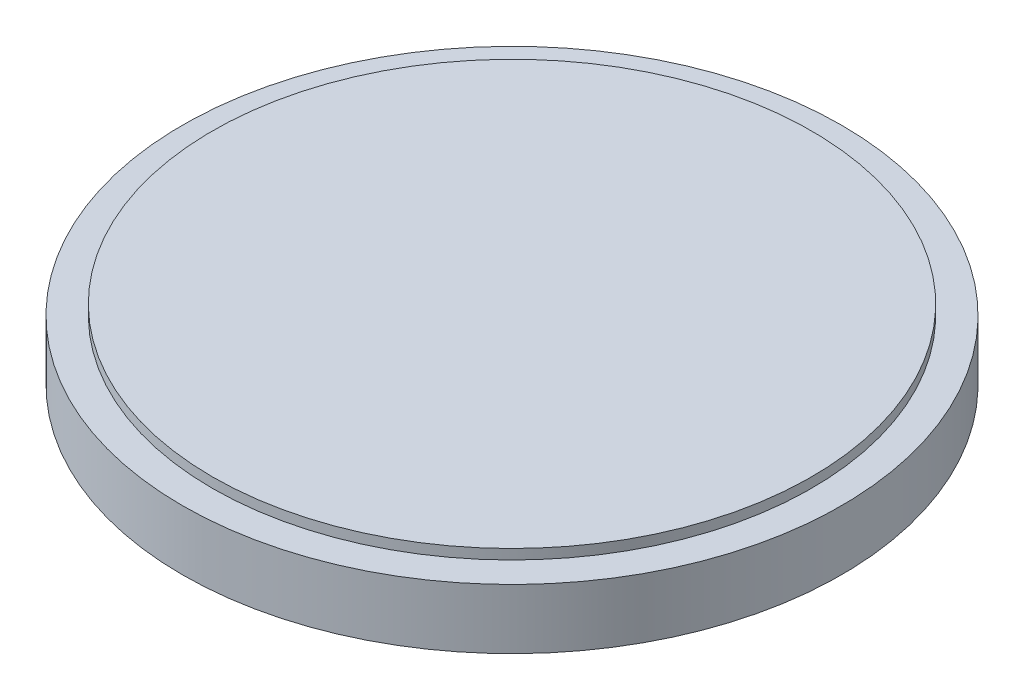
ISO-10303-21;
HEADER;
FILE_DESCRIPTION(('STEP AP214'),'2;1');
FILE_NAME('part.step','',(''),(''),'','','');
FILE_SCHEMA(('AUTOMOTIVE_DESIGN { 1 0 10303 214 1 1 1 1 }'));
ENDSEC;
DATA;
#1=APPLICATION_CONTEXT('core data for automotive mechanical design processes');
#2=APPLICATION_PROTOCOL_DEFINITION('international standard','automotive_design',2000,#1);
#3=PRODUCT_CONTEXT('',#1,'mechanical');
#4=PRODUCT('Part','Part','',(#3));
#5=PRODUCT_RELATED_PRODUCT_CATEGORY('part','',(#4));
#6=PRODUCT_DEFINITION_FORMATION('','',#4);
#7=PRODUCT_DEFINITION_CONTEXT('part definition',#1,'design');
#8=PRODUCT_DEFINITION('design','',#6,#7);
#9=PRODUCT_DEFINITION_SHAPE('','',#8);
#10=(LENGTH_UNIT() NAMED_UNIT(*) SI_UNIT(.MILLI.,.METRE.));
#11=(NAMED_UNIT(*) PLANE_ANGLE_UNIT() SI_UNIT($,.RADIAN.));
#12=(NAMED_UNIT(*) SI_UNIT($,.STERADIAN.) SOLID_ANGLE_UNIT());
#13=UNCERTAINTY_MEASURE_WITH_UNIT(LENGTH_MEASURE(1.E-05),#10,'distance_accuracy_value','');
#14=(GEOMETRIC_REPRESENTATION_CONTEXT(3) GLOBAL_UNCERTAINTY_ASSIGNED_CONTEXT((#13)) GLOBAL_UNIT_ASSIGNED_CONTEXT((#10,
#11,#12)) REPRESENTATION_CONTEXT('',''));
#15=CARTESIAN_POINT('',(0.,0.,0.));
#16=DIRECTION('',(0.,0.,1.));
#17=DIRECTION('',(1.,0.,0.));
#18=AXIS2_PLACEMENT_3D('',#15,#16,#17);
#19=CARTESIAN_POINT('',(0.,7.,0.));
#20=DIRECTION('',(0.,-1.,0.));
#21=DIRECTION('',(0.,0.,-1.));
#22=AXIS2_PLACEMENT_3D('',#19,#20,#21);
#23=CYLINDRICAL_SURFACE('',#22,30.);
#24=CARTESIAN_POINT('',(0.,7.,0.));
#25=DIRECTION('',(0.,1.,0.));
#26=DIRECTION('',(0.,0.,1.));
#27=AXIS2_PLACEMENT_3D('',#24,#25,#26);
#28=CIRCLE('',#27,30.);
#29=CARTESIAN_POINT('',(0.,7.,30.));
#30=VERTEX_POINT('',#29);
#31=EDGE_CURVE('E11',#30,#30,#28,.T.);
#32=ORIENTED_EDGE('',*,*,#31,.F.);
#33=EDGE_LOOP('',(#32));
#34=FACE_BOUND('',#33,.T.);
#35=CARTESIAN_POINT('',(0.,6.,0.));
#36=DIRECTION('',(0.,1.,0.));
#37=DIRECTION('',(0.,0.,1.));
#38=AXIS2_PLACEMENT_3D('',#35,#36,#37);
#39=CIRCLE('',#38,30.);
#40=CARTESIAN_POINT('',(0.,6.,30.));
#41=VERTEX_POINT('',#40);
#42=EDGE_CURVE('E55',#41,#41,#39,.T.);
#43=ORIENTED_EDGE('',*,*,#42,.T.);
#44=EDGE_LOOP('',(#43));
#45=FACE_BOUND('',#44,.T.);
#46=ADVANCED_FACE('F47',(#34,#45),#23,.T.);
#47=CARTESIAN_POINT('',(0.,7.,0.));
#48=DIRECTION('',(0.,1.,0.));
#49=DIRECTION('',(0.,0.,1.));
#50=AXIS2_PLACEMENT_3D('',#47,#48,#49);
#51=PLANE('',#50);
#52=ORIENTED_EDGE('',*,*,#31,.T.);
#53=EDGE_LOOP('',(#52));
#54=FACE_BOUND('',#53,.T.);
#55=ADVANCED_FACE('F65',(#54),#51,.T.);
#56=CARTESIAN_POINT('',(0.,6.,0.));
#57=DIRECTION('',(0.,1.,0.));
#58=DIRECTION('',(0.,0.,1.));
#59=AXIS2_PLACEMENT_3D('',#56,#57,#58);
#60=PLANE('',#59);
#61=ORIENTED_EDGE('',*,*,#42,.F.);
#62=EDGE_LOOP('',(#61));
#63=FACE_BOUND('',#62,.T.);
#64=ADVANCED_FACE('F64',(#63),#60,.F.);
#65=CLOSED_SHELL('',(#46,#55,#64));
#66=MANIFOLD_SOLID_BREP('B2',#65);
#67=CARTESIAN_POINT('',(0.,6.,0.));
#68=DIRECTION('',(0.,1.,0.));
#69=DIRECTION('',(0.,0.,1.));
#70=AXIS2_PLACEMENT_3D('',#67,#68,#69);
#71=PLANE('',#70);
#72=CARTESIAN_POINT('',(0.,6.,0.));
#73=DIRECTION('',(0.,1.,0.));
#74=DIRECTION('',(0.,0.,1.));
#75=AXIS2_PLACEMENT_3D('',#72,#73,#74);
#76=CIRCLE('',#75,33.);
#77=CARTESIAN_POINT('',(0.,6.,33.));
#78=VERTEX_POINT('',#77);
#79=EDGE_CURVE('E48',#78,#78,#76,.T.);
#80=ORIENTED_EDGE('',*,*,#79,.T.);
#81=EDGE_LOOP('',(#80));
#82=FACE_BOUND('',#81,.T.);
#83=CARTESIAN_POINT('',(0.,6.,0.));
#84=DIRECTION('',(0.,1.,0.));
#85=DIRECTION('',(0.,0.,1.));
#86=AXIS2_PLACEMENT_3D('',#83,#84,#85);
#87=CIRCLE('',#86,29.);
#88=CARTESIAN_POINT('',(0.,6.,29.));
#89=VERTEX_POINT('',#88);
#90=EDGE_CURVE('E101',#89,#89,#87,.T.);
#91=ORIENTED_EDGE('',*,*,#90,.F.);
#92=EDGE_LOOP('',(#91));
#93=FACE_BOUND('',#92,.T.);
#94=ADVANCED_FACE('F87',(#82,#93),#71,.T.);
#95=CARTESIAN_POINT('',(0.,0.,0.));
#96=DIRECTION('',(0.,1.,0.));
#97=DIRECTION('',(0.,0.,1.));
#98=AXIS2_PLACEMENT_3D('',#95,#96,#97);
#99=PLANE('',#98);
#100=CARTESIAN_POINT('',(0.,0.,0.));
#101=DIRECTION('',(0.,1.,0.));
#102=DIRECTION('',(0.,0.,1.));
#103=AXIS2_PLACEMENT_3D('',#100,#101,#102);
#104=CIRCLE('',#103,30.);
#105=CARTESIAN_POINT('',(0.,0.,30.));
#106=VERTEX_POINT('',#105);
#107=EDGE_CURVE('E110',#106,#106,#104,.T.);
#108=ORIENTED_EDGE('',*,*,#107,.T.);
#109=EDGE_LOOP('',(#108));
#110=FACE_BOUND('',#109,.T.);
#111=CARTESIAN_POINT('',(0.,0.,0.));
#112=DIRECTION('',(0.,1.,0.));
#113=DIRECTION('',(0.,0.,1.));
#114=AXIS2_PLACEMENT_3D('',#111,#112,#113);
#115=CIRCLE('',#114,33.);
#116=CARTESIAN_POINT('',(0.,0.,33.));
#117=VERTEX_POINT('',#116);
#118=EDGE_CURVE('E96',#117,#117,#115,.T.);
#119=ORIENTED_EDGE('',*,*,#118,.F.);
#120=EDGE_LOOP('',(#119));
#121=FACE_BOUND('',#120,.T.);
#122=ADVANCED_FACE('F127',(#110,#121),#99,.F.);
#123=CARTESIAN_POINT('',(0.,6.,0.));
#124=DIRECTION('',(0.,-1.,0.));
#125=DIRECTION('',(0.,0.,-1.));
#126=AXIS2_PLACEMENT_3D('',#123,#124,#125);
#127=CYLINDRICAL_SURFACE('',#126,33.);
#128=ORIENTED_EDGE('',*,*,#79,.F.);
#129=EDGE_LOOP('',(#128));
#130=FACE_BOUND('',#129,.T.);
#131=ORIENTED_EDGE('',*,*,#118,.T.);
#132=EDGE_LOOP('',(#131));
#133=FACE_BOUND('',#132,.T.);
#134=ADVANCED_FACE('F95',(#130,#133),#127,.T.);
#135=CARTESIAN_POINT('',(0.,6.,0.));
#136=DIRECTION('',(0.,-1.,0.));
#137=DIRECTION('',(0.,0.,-1.));
#138=AXIS2_PLACEMENT_3D('',#135,#136,#137);
#139=CYLINDRICAL_SURFACE('',#138,29.);
#140=CARTESIAN_POINT('',(0.,1.,0.));
#141=DIRECTION('',(0.,1.,0.));
#142=DIRECTION('',(0.,0.,1.));
#143=AXIS2_PLACEMENT_3D('',#140,#141,#142);
#144=CIRCLE('',#143,29.);
#145=CARTESIAN_POINT('',(0.,1.,29.));
#146=VERTEX_POINT('',#145);
#147=EDGE_CURVE('E92',#146,#146,#144,.T.);
#148=ORIENTED_EDGE('',*,*,#147,.F.);
#149=EDGE_LOOP('',(#148));
#150=FACE_BOUND('',#149,.T.);
#151=ORIENTED_EDGE('',*,*,#90,.T.);
#152=EDGE_LOOP('',(#151));
#153=FACE_BOUND('',#152,.T.);
#154=ADVANCED_FACE('F119',(#150,#153),#139,.F.);
#155=CARTESIAN_POINT('',(0.,1.,0.));
#156=DIRECTION('',(0.,-1.,0.));
#157=DIRECTION('',(0.,0.,-1.));
#158=AXIS2_PLACEMENT_3D('',#155,#156,#157);
#159=CYLINDRICAL_SURFACE('',#158,30.);
#160=CARTESIAN_POINT('',(0.,1.,0.));
#161=DIRECTION('',(0.,1.,0.));
#162=DIRECTION('',(0.,0.,1.));
#163=AXIS2_PLACEMENT_3D('',#160,#161,#162);
#164=CIRCLE('',#163,30.);
#165=CARTESIAN_POINT('',(0.,1.,30.));
#166=VERTEX_POINT('',#165);
#167=EDGE_CURVE('E109',#166,#166,#164,.T.);
#168=ORIENTED_EDGE('',*,*,#167,.T.);
#169=EDGE_LOOP('',(#168));
#170=FACE_BOUND('',#169,.T.);
#171=ORIENTED_EDGE('',*,*,#107,.F.);
#172=EDGE_LOOP('',(#171));
#173=FACE_BOUND('',#172,.T.);
#174=ADVANCED_FACE('F124',(#170,#173),#159,.F.);
#175=CARTESIAN_POINT('',(0.,1.,0.));
#176=DIRECTION('',(0.,1.,0.));
#177=DIRECTION('',(0.,0.,1.));
#178=AXIS2_PLACEMENT_3D('',#175,#176,#177);
#179=PLANE('',#178);
#180=ORIENTED_EDGE('',*,*,#147,.T.);
#181=EDGE_LOOP('',(#180));
#182=FACE_BOUND('',#181,.T.);
#183=ORIENTED_EDGE('',*,*,#167,.F.);
#184=EDGE_LOOP('',(#183));
#185=FACE_BOUND('',#184,.T.);
#186=ADVANCED_FACE('F120',(#182,#185),#179,.F.);
#187=CLOSED_SHELL('',(#94,#122,#134,#154,#174,#186));
#188=MANIFOLD_SOLID_BREP('B6',#187);
#189=ADVANCED_BREP_SHAPE_REPRESENTATION('',(#18,#66,#188),#14);
#190=SHAPE_DEFINITION_REPRESENTATION(#9,#189);
ENDSEC;
END-ISO-10303-21;
